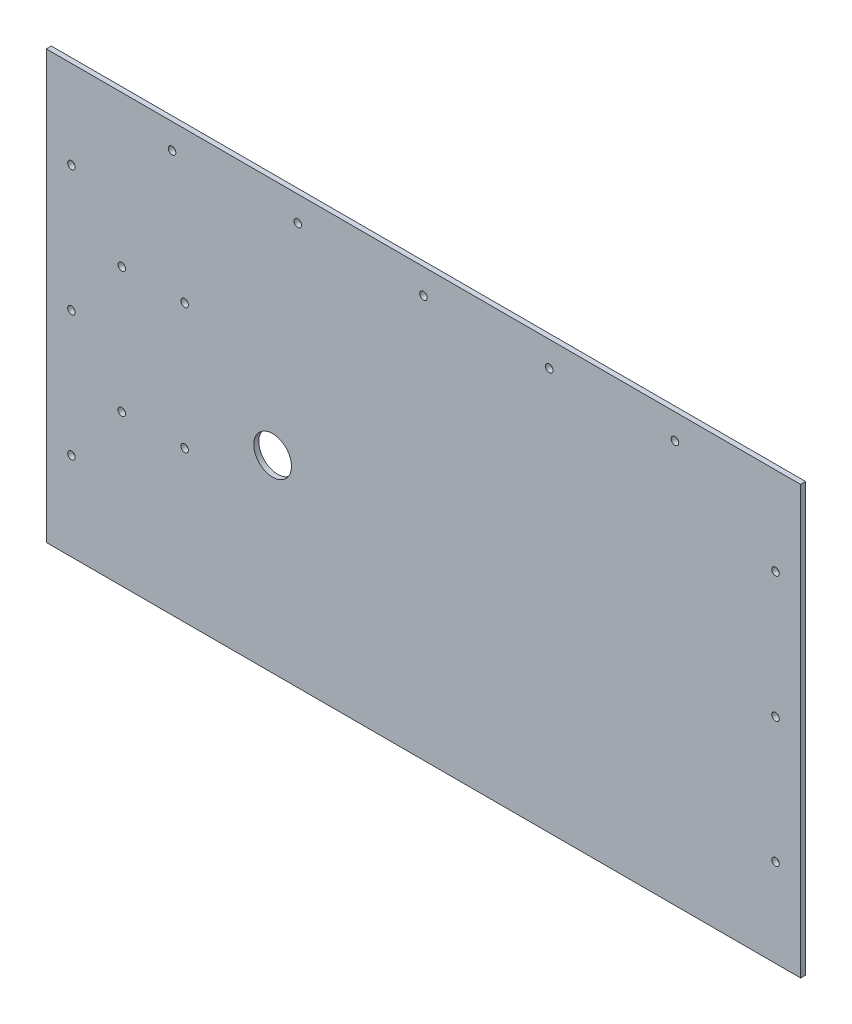
ISO-10303-21;
HEADER;
FILE_DESCRIPTION(('STEP AP214'),'2;1');
FILE_NAME('part.step','',(''),(''),'','','');
FILE_SCHEMA(('AUTOMOTIVE_DESIGN { 1 0 10303 214 1 1 1 1 }'));
ENDSEC;
DATA;
#1=APPLICATION_CONTEXT('core data for automotive mechanical design processes');
#2=APPLICATION_PROTOCOL_DEFINITION('international standard','automotive_design',2000,#1);
#3=PRODUCT_CONTEXT('',#1,'mechanical');
#4=PRODUCT('Part','Part','',(#3));
#5=PRODUCT_RELATED_PRODUCT_CATEGORY('part','',(#4));
#6=PRODUCT_DEFINITION_FORMATION('','',#4);
#7=PRODUCT_DEFINITION_CONTEXT('part definition',#1,'design');
#8=PRODUCT_DEFINITION('design','',#6,#7);
#9=PRODUCT_DEFINITION_SHAPE('','',#8);
#10=(LENGTH_UNIT() NAMED_UNIT(*) SI_UNIT(.MILLI.,.METRE.));
#11=(NAMED_UNIT(*) PLANE_ANGLE_UNIT() SI_UNIT($,.RADIAN.));
#12=(NAMED_UNIT(*) SI_UNIT($,.STERADIAN.) SOLID_ANGLE_UNIT());
#13=UNCERTAINTY_MEASURE_WITH_UNIT(LENGTH_MEASURE(1.E-05),#10,'distance_accuracy_value','');
#14=(GEOMETRIC_REPRESENTATION_CONTEXT(3) GLOBAL_UNCERTAINTY_ASSIGNED_CONTEXT((#13)) GLOBAL_UNIT_ASSIGNED_CONTEXT((#10,
#11,#12)) REPRESENTATION_CONTEXT('',''));
#15=CARTESIAN_POINT('',(0.,0.,0.));
#16=DIRECTION('',(0.,0.,1.));
#17=DIRECTION('',(1.,0.,0.));
#18=AXIS2_PLACEMENT_3D('',#15,#16,#17);
#19=CARTESIAN_POINT('',(150.,-85.,2.));
#20=DIRECTION('',(-1.,0.,0.));
#21=DIRECTION('',(0.,0.,1.));
#22=AXIS2_PLACEMENT_3D('',#19,#20,#21);
#23=PLANE('',#22);
#24=DIRECTION('',(0.,1.,0.));
#25=VECTOR('',#24,1.);
#26=CARTESIAN_POINT('',(150.,-85.,0.));
#27=LINE('',#26,#25);
#28=CARTESIAN_POINT('',(150.,-85.,0.));
#29=VERTEX_POINT('',#28);
#30=CARTESIAN_POINT('',(150.,85.,0.));
#31=VERTEX_POINT('',#30);
#32=EDGE_CURVE('E102',#29,#31,#27,.T.);
#33=ORIENTED_EDGE('',*,*,#32,.T.);
#34=DIRECTION('',(0.,0.,-1.));
#35=VECTOR('',#34,1.);
#36=CARTESIAN_POINT('',(150.,85.,2.));
#37=LINE('',#36,#35);
#38=CARTESIAN_POINT('',(150.,85.,2.));
#39=VERTEX_POINT('',#38);
#40=EDGE_CURVE('E93',#39,#31,#37,.T.);
#41=ORIENTED_EDGE('',*,*,#40,.F.);
#42=DIRECTION('',(0.,1.,0.));
#43=VECTOR('',#42,1.);
#44=CARTESIAN_POINT('',(150.,-85.,2.));
#45=LINE('',#44,#43);
#46=CARTESIAN_POINT('',(150.,-85.,2.));
#47=VERTEX_POINT('',#46);
#48=EDGE_CURVE('E87',#47,#39,#45,.T.);
#49=ORIENTED_EDGE('',*,*,#48,.F.);
#50=DIRECTION('',(0.,0.,-1.));
#51=VECTOR('',#50,1.);
#52=CARTESIAN_POINT('',(150.,-85.,2.));
#53=LINE('',#52,#51);
#54=EDGE_CURVE('E98',#47,#29,#53,.T.);
#55=ORIENTED_EDGE('',*,*,#54,.T.);
#56=EDGE_LOOP('',(#33,#41,#49,#55));
#57=FACE_BOUND('',#56,.T.);
#58=ADVANCED_FACE('F33',(#57),#23,.F.);
#59=CARTESIAN_POINT('',(-150.,85.,2.));
#60=DIRECTION('',(0.,-1.,0.));
#61=DIRECTION('',(0.,0.,-1.));
#62=AXIS2_PLACEMENT_3D('',#59,#60,#61);
#63=PLANE('',#62);
#64=DIRECTION('',(-1.,0.,0.));
#65=VECTOR('',#64,1.);
#66=CARTESIAN_POINT('',(-150.,85.,0.));
#67=LINE('',#66,#65);
#68=CARTESIAN_POINT('',(-150.,85.,0.));
#69=VERTEX_POINT('',#68);
#70=EDGE_CURVE('E92',#31,#69,#67,.T.);
#71=ORIENTED_EDGE('',*,*,#70,.T.);
#72=DIRECTION('',(0.,0.,-1.));
#73=VECTOR('',#72,1.);
#74=CARTESIAN_POINT('',(-150.,85.,2.));
#75=LINE('',#74,#73);
#76=CARTESIAN_POINT('',(-150.,85.,2.));
#77=VERTEX_POINT('',#76);
#78=EDGE_CURVE('E90',#77,#69,#75,.T.);
#79=ORIENTED_EDGE('',*,*,#78,.F.);
#80=DIRECTION('',(-1.,0.,0.));
#81=VECTOR('',#80,1.);
#82=CARTESIAN_POINT('',(-150.,85.,2.));
#83=LINE('',#82,#81);
#84=EDGE_CURVE('E81',#39,#77,#83,.T.);
#85=ORIENTED_EDGE('',*,*,#84,.F.);
#86=ORIENTED_EDGE('',*,*,#40,.T.);
#87=EDGE_LOOP('',(#71,#79,#85,#86));
#88=FACE_BOUND('',#87,.T.);
#89=ADVANCED_FACE('F91',(#88),#63,.F.);
#90=CARTESIAN_POINT('',(-150.,-85.,2.));
#91=DIRECTION('',(1.,0.,0.));
#92=DIRECTION('',(0.,0.,-1.));
#93=AXIS2_PLACEMENT_3D('',#90,#91,#92);
#94=PLANE('',#93);
#95=DIRECTION('',(0.,-1.,0.));
#96=VECTOR('',#95,1.);
#97=CARTESIAN_POINT('',(-150.,-85.,0.));
#98=LINE('',#97,#96);
#99=CARTESIAN_POINT('',(-150.,-85.,0.));
#100=VERTEX_POINT('',#99);
#101=EDGE_CURVE('E67',#69,#100,#98,.T.);
#102=ORIENTED_EDGE('',*,*,#101,.T.);
#103=DIRECTION('',(0.,0.,-1.));
#104=VECTOR('',#103,1.);
#105=CARTESIAN_POINT('',(-150.,-85.,2.));
#106=LINE('',#105,#104);
#107=CARTESIAN_POINT('',(-150.,-85.,2.));
#108=VERTEX_POINT('',#107);
#109=EDGE_CURVE('E94',#108,#100,#106,.T.);
#110=ORIENTED_EDGE('',*,*,#109,.F.);
#111=DIRECTION('',(0.,-1.,0.));
#112=VECTOR('',#111,1.);
#113=CARTESIAN_POINT('',(-150.,-85.,2.));
#114=LINE('',#113,#112);
#115=EDGE_CURVE('E85',#77,#108,#114,.T.);
#116=ORIENTED_EDGE('',*,*,#115,.F.);
#117=ORIENTED_EDGE('',*,*,#78,.T.);
#118=EDGE_LOOP('',(#102,#110,#116,#117));
#119=FACE_BOUND('',#118,.T.);
#120=ADVANCED_FACE('F96',(#119),#94,.F.);
#121=CARTESIAN_POINT('',(-150.,-85.,2.));
#122=DIRECTION('',(0.,1.,0.));
#123=DIRECTION('',(0.,0.,1.));
#124=AXIS2_PLACEMENT_3D('',#121,#122,#123);
#125=PLANE('',#124);
#126=DIRECTION('',(1.,0.,0.));
#127=VECTOR('',#126,1.);
#128=CARTESIAN_POINT('',(-150.,-85.,0.));
#129=LINE('',#128,#127);
#130=EDGE_CURVE('E73',#100,#29,#129,.T.);
#131=ORIENTED_EDGE('',*,*,#130,.T.);
#132=ORIENTED_EDGE('',*,*,#54,.F.);
#133=DIRECTION('',(1.,0.,0.));
#134=VECTOR('',#133,1.);
#135=CARTESIAN_POINT('',(-150.,-85.,2.));
#136=LINE('',#135,#134);
#137=EDGE_CURVE('E50',#108,#47,#136,.T.);
#138=ORIENTED_EDGE('',*,*,#137,.F.);
#139=ORIENTED_EDGE('',*,*,#109,.T.);
#140=EDGE_LOOP('',(#131,#132,#138,#139));
#141=FACE_BOUND('',#140,.T.);
#142=ADVANCED_FACE('F181',(#141),#125,.F.);
#143=CARTESIAN_POINT('',(150.,85.,2.));
#144=DIRECTION('',(0.,0.,-1.));
#145=DIRECTION('',(-1.,0.,0.));
#146=AXIS2_PLACEMENT_3D('',#143,#144,#145);
#147=PLANE('',#146);
#148=CARTESIAN_POINT('',(-60.,-10.,2.));
#149=DIRECTION('',(0.,0.,1.));
#150=DIRECTION('',(1.,0.,0.));
#151=AXIS2_PLACEMENT_3D('',#148,#149,#150);
#152=CIRCLE('',#151,7.5);
#153=CARTESIAN_POINT('',(-52.5,-10.,2.));
#154=VERTEX_POINT('',#153);
#155=EDGE_CURVE('E496',#154,#154,#152,.T.);
#156=ORIENTED_EDGE('',*,*,#155,.F.);
#157=EDGE_LOOP('',(#156));
#158=FACE_BOUND('',#157,.T.);
#159=CARTESIAN_POINT('',(-120.,-25.,2.));
#160=DIRECTION('',(0.,0.,1.));
#161=DIRECTION('',(1.,0.,0.));
#162=AXIS2_PLACEMENT_3D('',#159,#160,#161);
#163=CIRCLE('',#162,1.5);
#164=CARTESIAN_POINT('',(-118.5,-25.,2.));
#165=VERTEX_POINT('',#164);
#166=EDGE_CURVE('E502',#165,#165,#163,.T.);
#167=ORIENTED_EDGE('',*,*,#166,.F.);
#168=EDGE_LOOP('',(#167));
#169=FACE_BOUND('',#168,.T.);
#170=CARTESIAN_POINT('',(-120.,25.,2.));
#171=DIRECTION('',(0.,0.,1.));
#172=DIRECTION('',(1.,0.,0.));
#173=AXIS2_PLACEMENT_3D('',#170,#171,#172);
#174=CIRCLE('',#173,1.5);
#175=CARTESIAN_POINT('',(-118.5,25.,2.));
#176=VERTEX_POINT('',#175);
#177=EDGE_CURVE('E159',#176,#176,#174,.T.);
#178=ORIENTED_EDGE('',*,*,#177,.F.);
#179=EDGE_LOOP('',(#178));
#180=FACE_BOUND('',#179,.T.);
#181=CARTESIAN_POINT('',(-140.,0.,2.));
#182=DIRECTION('',(0.,0.,1.));
#183=DIRECTION('',(1.,0.,0.));
#184=AXIS2_PLACEMENT_3D('',#181,#182,#183);
#185=CIRCLE('',#184,1.5);
#186=CARTESIAN_POINT('',(-138.5,0.,2.));
#187=VERTEX_POINT('',#186);
#188=EDGE_CURVE('E509',#187,#187,#185,.T.);
#189=ORIENTED_EDGE('',*,*,#188,.F.);
#190=EDGE_LOOP('',(#189));
#191=FACE_BOUND('',#190,.T.);
#192=CARTESIAN_POINT('',(-140.,50.,2.));
#193=DIRECTION('',(0.,0.,1.));
#194=DIRECTION('',(1.,0.,0.));
#195=AXIS2_PLACEMENT_3D('',#192,#193,#194);
#196=CIRCLE('',#195,1.5);
#197=CARTESIAN_POINT('',(-138.5,50.,2.));
#198=VERTEX_POINT('',#197);
#199=EDGE_CURVE('E512',#198,#198,#196,.T.);
#200=ORIENTED_EDGE('',*,*,#199,.F.);
#201=EDGE_LOOP('',(#200));
#202=FACE_BOUND('',#201,.T.);
#203=CARTESIAN_POINT('',(-50.,75.,2.));
#204=DIRECTION('',(0.,0.,1.));
#205=DIRECTION('',(1.,0.,0.));
#206=AXIS2_PLACEMENT_3D('',#203,#204,#205);
#207=CIRCLE('',#206,1.5);
#208=CARTESIAN_POINT('',(-48.5,75.,2.));
#209=VERTEX_POINT('',#208);
#210=EDGE_CURVE('E269',#209,#209,#207,.T.);
#211=ORIENTED_EDGE('',*,*,#210,.F.);
#212=EDGE_LOOP('',(#211));
#213=FACE_BOUND('',#212,.T.);
#214=CARTESIAN_POINT('',(-100.,75.,2.));
#215=DIRECTION('',(0.,0.,1.));
#216=DIRECTION('',(1.,0.,0.));
#217=AXIS2_PLACEMENT_3D('',#214,#215,#216);
#218=CIRCLE('',#217,1.5);
#219=CARTESIAN_POINT('',(-98.5,75.,2.));
#220=VERTEX_POINT('',#219);
#221=EDGE_CURVE('E271',#220,#220,#218,.T.);
#222=ORIENTED_EDGE('',*,*,#221,.F.);
#223=EDGE_LOOP('',(#222));
#224=FACE_BOUND('',#223,.T.);
#225=ORIENTED_EDGE('',*,*,#48,.T.);
#226=ORIENTED_EDGE('',*,*,#84,.T.);
#227=ORIENTED_EDGE('',*,*,#115,.T.);
#228=ORIENTED_EDGE('',*,*,#137,.T.);
#229=EDGE_LOOP('',(#225,#226,#227,#228));
#230=FACE_BOUND('',#229,.T.);
#231=CARTESIAN_POINT('',(0.,75.,2.));
#232=DIRECTION('',(0.,0.,1.));
#233=DIRECTION('',(1.,0.,0.));
#234=AXIS2_PLACEMENT_3D('',#231,#232,#233);
#235=CIRCLE('',#234,1.5);
#236=CARTESIAN_POINT('',(1.50000000000003,75.,2.));
#237=VERTEX_POINT('',#236);
#238=EDGE_CURVE('E115',#237,#237,#235,.T.);
#239=ORIENTED_EDGE('',*,*,#238,.F.);
#240=EDGE_LOOP('',(#239));
#241=FACE_BOUND('',#240,.T.);
#242=CARTESIAN_POINT('',(50.,75.,2.));
#243=DIRECTION('',(0.,0.,1.));
#244=DIRECTION('',(1.,0.,0.));
#245=AXIS2_PLACEMENT_3D('',#242,#243,#244);
#246=CIRCLE('',#245,1.5);
#247=CARTESIAN_POINT('',(51.5,75.,2.));
#248=VERTEX_POINT('',#247);
#249=EDGE_CURVE('E121',#248,#248,#246,.T.);
#250=ORIENTED_EDGE('',*,*,#249,.F.);
#251=EDGE_LOOP('',(#250));
#252=FACE_BOUND('',#251,.T.);
#253=CARTESIAN_POINT('',(100.,75.,2.));
#254=DIRECTION('',(0.,0.,1.));
#255=DIRECTION('',(1.,0.,0.));
#256=AXIS2_PLACEMENT_3D('',#253,#254,#255);
#257=CIRCLE('',#256,1.5);
#258=CARTESIAN_POINT('',(101.5,75.,2.));
#259=VERTEX_POINT('',#258);
#260=EDGE_CURVE('E127',#259,#259,#257,.T.);
#261=ORIENTED_EDGE('',*,*,#260,.F.);
#262=EDGE_LOOP('',(#261));
#263=FACE_BOUND('',#262,.T.);
#264=CARTESIAN_POINT('',(-140.,-50.,2.));
#265=DIRECTION('',(0.,0.,1.));
#266=DIRECTION('',(1.,0.,0.));
#267=AXIS2_PLACEMENT_3D('',#264,#265,#266);
#268=CIRCLE('',#267,1.5);
#269=CARTESIAN_POINT('',(-138.5,-50.,2.));
#270=VERTEX_POINT('',#269);
#271=EDGE_CURVE('E133',#270,#270,#268,.T.);
#272=ORIENTED_EDGE('',*,*,#271,.F.);
#273=EDGE_LOOP('',(#272));
#274=FACE_BOUND('',#273,.T.);
#275=CARTESIAN_POINT('',(140.,50.,2.));
#276=DIRECTION('',(0.,0.,1.));
#277=DIRECTION('',(1.,0.,0.));
#278=AXIS2_PLACEMENT_3D('',#275,#276,#277);
#279=CIRCLE('',#278,1.5);
#280=CARTESIAN_POINT('',(141.5,50.,2.));
#281=VERTEX_POINT('',#280);
#282=EDGE_CURVE('E139',#281,#281,#279,.T.);
#283=ORIENTED_EDGE('',*,*,#282,.F.);
#284=EDGE_LOOP('',(#283));
#285=FACE_BOUND('',#284,.T.);
#286=CARTESIAN_POINT('',(140.,0.,2.));
#287=DIRECTION('',(0.,0.,1.));
#288=DIRECTION('',(1.,0.,0.));
#289=AXIS2_PLACEMENT_3D('',#286,#287,#288);
#290=CIRCLE('',#289,1.5);
#291=CARTESIAN_POINT('',(141.5,0.,2.));
#292=VERTEX_POINT('',#291);
#293=EDGE_CURVE('E145',#292,#292,#290,.T.);
#294=ORIENTED_EDGE('',*,*,#293,.F.);
#295=EDGE_LOOP('',(#294));
#296=FACE_BOUND('',#295,.T.);
#297=CARTESIAN_POINT('',(140.,-50.,2.));
#298=DIRECTION('',(0.,0.,1.));
#299=DIRECTION('',(1.,0.,0.));
#300=AXIS2_PLACEMENT_3D('',#297,#298,#299);
#301=CIRCLE('',#300,1.5);
#302=CARTESIAN_POINT('',(141.5,-50.,2.));
#303=VERTEX_POINT('',#302);
#304=EDGE_CURVE('E151',#303,#303,#301,.T.);
#305=ORIENTED_EDGE('',*,*,#304,.F.);
#306=EDGE_LOOP('',(#305));
#307=FACE_BOUND('',#306,.T.);
#308=CARTESIAN_POINT('',(-95.,25.,2.));
#309=DIRECTION('',(0.,0.,1.));
#310=DIRECTION('',(1.,0.,0.));
#311=AXIS2_PLACEMENT_3D('',#308,#309,#310);
#312=CIRCLE('',#311,1.5);
#313=CARTESIAN_POINT('',(-93.5,25.,2.));
#314=VERTEX_POINT('',#313);
#315=EDGE_CURVE('E162',#314,#314,#312,.T.);
#316=ORIENTED_EDGE('',*,*,#315,.F.);
#317=EDGE_LOOP('',(#316));
#318=FACE_BOUND('',#317,.T.);
#319=CARTESIAN_POINT('',(-95.,-25.,2.));
#320=DIRECTION('',(0.,0.,1.));
#321=DIRECTION('',(1.,0.,0.));
#322=AXIS2_PLACEMENT_3D('',#319,#320,#321);
#323=CIRCLE('',#322,1.5);
#324=CARTESIAN_POINT('',(-93.5,-25.,2.));
#325=VERTEX_POINT('',#324);
#326=EDGE_CURVE('E11',#325,#325,#323,.T.);
#327=ORIENTED_EDGE('',*,*,#326,.F.);
#328=EDGE_LOOP('',(#327));
#329=FACE_BOUND('',#328,.T.);
#330=ADVANCED_FACE('F82',(#158,#169,#180,#191,#202,#213,#224,#230,#241,#252,#263,#274,#285,#296,
#307,#318,#329),#147,.F.);
#331=CARTESIAN_POINT('',(150.,85.,0.));
#332=DIRECTION('',(0.,0.,-1.));
#333=DIRECTION('',(-1.,0.,0.));
#334=AXIS2_PLACEMENT_3D('',#331,#332,#333);
#335=PLANE('',#334);
#336=CARTESIAN_POINT('',(-60.,-10.,0.));
#337=DIRECTION('',(0.,0.,1.));
#338=DIRECTION('',(1.,0.,0.));
#339=AXIS2_PLACEMENT_3D('',#336,#337,#338);
#340=CIRCLE('',#339,7.5);
#341=CARTESIAN_POINT('',(-52.5,-10.,0.));
#342=VERTEX_POINT('',#341);
#343=EDGE_CURVE('E493',#342,#342,#340,.T.);
#344=ORIENTED_EDGE('',*,*,#343,.T.);
#345=EDGE_LOOP('',(#344));
#346=FACE_BOUND('',#345,.T.);
#347=CARTESIAN_POINT('',(-120.,-25.,0.));
#348=DIRECTION('',(0.,0.,-1.));
#349=DIRECTION('',(-1.,0.,0.));
#350=AXIS2_PLACEMENT_3D('',#347,#348,#349);
#351=CIRCLE('',#350,1.5);
#352=CARTESIAN_POINT('',(-121.5,-25.,0.));
#353=VERTEX_POINT('',#352);
#354=EDGE_CURVE('E498',#353,#353,#351,.T.);
#355=ORIENTED_EDGE('',*,*,#354,.F.);
#356=EDGE_LOOP('',(#355));
#357=FACE_BOUND('',#356,.T.);
#358=CARTESIAN_POINT('',(-120.,25.,0.));
#359=DIRECTION('',(0.,0.,-1.));
#360=DIRECTION('',(-1.,0.,0.));
#361=AXIS2_PLACEMENT_3D('',#358,#359,#360);
#362=CIRCLE('',#361,1.5);
#363=CARTESIAN_POINT('',(-121.5,25.,0.));
#364=VERTEX_POINT('',#363);
#365=EDGE_CURVE('E155',#364,#364,#362,.T.);
#366=ORIENTED_EDGE('',*,*,#365,.F.);
#367=EDGE_LOOP('',(#366));
#368=FACE_BOUND('',#367,.T.);
#369=CARTESIAN_POINT('',(-140.,0.,0.));
#370=DIRECTION('',(0.,0.,1.));
#371=DIRECTION('',(1.,0.,0.));
#372=AXIS2_PLACEMENT_3D('',#369,#370,#371);
#373=CIRCLE('',#372,1.5);
#374=CARTESIAN_POINT('',(-138.5,0.,0.));
#375=VERTEX_POINT('',#374);
#376=EDGE_CURVE('E158',#375,#375,#373,.T.);
#377=ORIENTED_EDGE('',*,*,#376,.T.);
#378=EDGE_LOOP('',(#377));
#379=FACE_BOUND('',#378,.T.);
#380=CARTESIAN_POINT('',(-140.,50.,0.));
#381=DIRECTION('',(0.,0.,1.));
#382=DIRECTION('',(1.,0.,0.));
#383=AXIS2_PLACEMENT_3D('',#380,#381,#382);
#384=CIRCLE('',#383,1.5);
#385=CARTESIAN_POINT('',(-138.5,50.,0.));
#386=VERTEX_POINT('',#385);
#387=EDGE_CURVE('E275',#386,#386,#384,.T.);
#388=ORIENTED_EDGE('',*,*,#387,.T.);
#389=EDGE_LOOP('',(#388));
#390=FACE_BOUND('',#389,.T.);
#391=CARTESIAN_POINT('',(-50.,75.,0.));
#392=DIRECTION('',(0.,0.,1.));
#393=DIRECTION('',(1.,0.,0.));
#394=AXIS2_PLACEMENT_3D('',#391,#392,#393);
#395=CIRCLE('',#394,1.5);
#396=CARTESIAN_POINT('',(-48.5,75.,0.));
#397=VERTEX_POINT('',#396);
#398=EDGE_CURVE('E266',#397,#397,#395,.T.);
#399=ORIENTED_EDGE('',*,*,#398,.T.);
#400=EDGE_LOOP('',(#399));
#401=FACE_BOUND('',#400,.T.);
#402=CARTESIAN_POINT('',(-100.,75.,0.));
#403=DIRECTION('',(0.,0.,1.));
#404=DIRECTION('',(1.,0.,0.));
#405=AXIS2_PLACEMENT_3D('',#402,#403,#404);
#406=CIRCLE('',#405,1.5);
#407=CARTESIAN_POINT('',(-98.5,75.,0.));
#408=VERTEX_POINT('',#407);
#409=EDGE_CURVE('E105',#408,#408,#406,.T.);
#410=ORIENTED_EDGE('',*,*,#409,.T.);
#411=EDGE_LOOP('',(#410));
#412=FACE_BOUND('',#411,.T.);
#413=ORIENTED_EDGE('',*,*,#32,.F.);
#414=ORIENTED_EDGE('',*,*,#130,.F.);
#415=ORIENTED_EDGE('',*,*,#101,.F.);
#416=ORIENTED_EDGE('',*,*,#70,.F.);
#417=EDGE_LOOP('',(#413,#414,#415,#416));
#418=FACE_BOUND('',#417,.T.);
#419=CARTESIAN_POINT('',(0.,75.,0.));
#420=DIRECTION('',(0.,0.,1.));
#421=DIRECTION('',(1.,0.,0.));
#422=AXIS2_PLACEMENT_3D('',#419,#420,#421);
#423=CIRCLE('',#422,1.5);
#424=CARTESIAN_POINT('',(1.50000000000003,75.,0.));
#425=VERTEX_POINT('',#424);
#426=EDGE_CURVE('E112',#425,#425,#423,.T.);
#427=ORIENTED_EDGE('',*,*,#426,.T.);
#428=EDGE_LOOP('',(#427));
#429=FACE_BOUND('',#428,.T.);
#430=CARTESIAN_POINT('',(50.,75.,0.));
#431=DIRECTION('',(0.,0.,1.));
#432=DIRECTION('',(1.,0.,0.));
#433=AXIS2_PLACEMENT_3D('',#430,#431,#432);
#434=CIRCLE('',#433,1.5);
#435=CARTESIAN_POINT('',(51.5,75.,0.));
#436=VERTEX_POINT('',#435);
#437=EDGE_CURVE('E118',#436,#436,#434,.T.);
#438=ORIENTED_EDGE('',*,*,#437,.T.);
#439=EDGE_LOOP('',(#438));
#440=FACE_BOUND('',#439,.T.);
#441=CARTESIAN_POINT('',(100.,75.,0.));
#442=DIRECTION('',(0.,0.,1.));
#443=DIRECTION('',(1.,0.,0.));
#444=AXIS2_PLACEMENT_3D('',#441,#442,#443);
#445=CIRCLE('',#444,1.5);
#446=CARTESIAN_POINT('',(101.5,75.,0.));
#447=VERTEX_POINT('',#446);
#448=EDGE_CURVE('E124',#447,#447,#445,.T.);
#449=ORIENTED_EDGE('',*,*,#448,.T.);
#450=EDGE_LOOP('',(#449));
#451=FACE_BOUND('',#450,.T.);
#452=CARTESIAN_POINT('',(-140.,-50.,0.));
#453=DIRECTION('',(0.,0.,1.));
#454=DIRECTION('',(1.,0.,0.));
#455=AXIS2_PLACEMENT_3D('',#452,#453,#454);
#456=CIRCLE('',#455,1.5);
#457=CARTESIAN_POINT('',(-138.5,-50.,0.));
#458=VERTEX_POINT('',#457);
#459=EDGE_CURVE('E130',#458,#458,#456,.T.);
#460=ORIENTED_EDGE('',*,*,#459,.T.);
#461=EDGE_LOOP('',(#460));
#462=FACE_BOUND('',#461,.T.);
#463=CARTESIAN_POINT('',(140.,50.,0.));
#464=DIRECTION('',(0.,0.,1.));
#465=DIRECTION('',(1.,0.,0.));
#466=AXIS2_PLACEMENT_3D('',#463,#464,#465);
#467=CIRCLE('',#466,1.5);
#468=CARTESIAN_POINT('',(141.5,50.,0.));
#469=VERTEX_POINT('',#468);
#470=EDGE_CURVE('E136',#469,#469,#467,.T.);
#471=ORIENTED_EDGE('',*,*,#470,.T.);
#472=EDGE_LOOP('',(#471));
#473=FACE_BOUND('',#472,.T.);
#474=CARTESIAN_POINT('',(140.,0.,0.));
#475=DIRECTION('',(0.,0.,1.));
#476=DIRECTION('',(1.,0.,0.));
#477=AXIS2_PLACEMENT_3D('',#474,#475,#476);
#478=CIRCLE('',#477,1.5);
#479=CARTESIAN_POINT('',(141.5,0.,0.));
#480=VERTEX_POINT('',#479);
#481=EDGE_CURVE('E142',#480,#480,#478,.T.);
#482=ORIENTED_EDGE('',*,*,#481,.T.);
#483=EDGE_LOOP('',(#482));
#484=FACE_BOUND('',#483,.T.);
#485=CARTESIAN_POINT('',(140.,-50.,0.));
#486=DIRECTION('',(0.,0.,1.));
#487=DIRECTION('',(1.,0.,0.));
#488=AXIS2_PLACEMENT_3D('',#485,#486,#487);
#489=CIRCLE('',#488,1.5);
#490=CARTESIAN_POINT('',(141.5,-50.,0.));
#491=VERTEX_POINT('',#490);
#492=EDGE_CURVE('E148',#491,#491,#489,.T.);
#493=ORIENTED_EDGE('',*,*,#492,.T.);
#494=EDGE_LOOP('',(#493));
#495=FACE_BOUND('',#494,.T.);
#496=CARTESIAN_POINT('',(-95.,25.,0.));
#497=DIRECTION('',(0.,0.,-1.));
#498=DIRECTION('',(-1.,0.,0.));
#499=AXIS2_PLACEMENT_3D('',#496,#497,#498);
#500=CIRCLE('',#499,1.5);
#501=CARTESIAN_POINT('',(-96.5,25.,0.));
#502=VERTEX_POINT('',#501);
#503=EDGE_CURVE('E154',#502,#502,#500,.T.);
#504=ORIENTED_EDGE('',*,*,#503,.F.);
#505=EDGE_LOOP('',(#504));
#506=FACE_BOUND('',#505,.T.);
#507=CARTESIAN_POINT('',(-95.,-25.,0.));
#508=DIRECTION('',(0.,0.,-1.));
#509=DIRECTION('',(-1.,0.,0.));
#510=AXIS2_PLACEMENT_3D('',#507,#508,#509);
#511=CIRCLE('',#510,1.5);
#512=CARTESIAN_POINT('',(-96.5,-25.,0.));
#513=VERTEX_POINT('',#512);
#514=EDGE_CURVE('E42',#513,#513,#511,.T.);
#515=ORIENTED_EDGE('',*,*,#514,.F.);
#516=EDGE_LOOP('',(#515));
#517=FACE_BOUND('',#516,.T.);
#518=ADVANCED_FACE('F169',(#346,#357,#368,#379,#390,#401,#412,#418,#429,#440,#451,#462,#473,
#484,#495,#506,#517),#335,.T.);
#519=CARTESIAN_POINT('',(-100.,75.,0.));
#520=DIRECTION('',(0.,0.,1.));
#521=DIRECTION('',(1.,0.,0.));
#522=AXIS2_PLACEMENT_3D('',#519,#520,#521);
#523=CYLINDRICAL_SURFACE('',#522,1.5);
#524=ORIENTED_EDGE('',*,*,#409,.F.);
#525=EDGE_LOOP('',(#524));
#526=FACE_BOUND('',#525,.T.);
#527=ORIENTED_EDGE('',*,*,#221,.T.);
#528=EDGE_LOOP('',(#527));
#529=FACE_BOUND('',#528,.T.);
#530=ADVANCED_FACE('F171',(#526,#529),#523,.F.);
#531=CARTESIAN_POINT('',(-50.,75.,0.));
#532=DIRECTION('',(0.,0.,1.));
#533=DIRECTION('',(1.,0.,0.));
#534=AXIS2_PLACEMENT_3D('',#531,#532,#533);
#535=CYLINDRICAL_SURFACE('',#534,1.5);
#536=ORIENTED_EDGE('',*,*,#398,.F.);
#537=EDGE_LOOP('',(#536));
#538=FACE_BOUND('',#537,.T.);
#539=ORIENTED_EDGE('',*,*,#210,.T.);
#540=EDGE_LOOP('',(#539));
#541=FACE_BOUND('',#540,.T.);
#542=ADVANCED_FACE('F178',(#538,#541),#535,.F.);
#543=CARTESIAN_POINT('',(0.,75.,0.));
#544=DIRECTION('',(0.,0.,1.));
#545=DIRECTION('',(1.,0.,0.));
#546=AXIS2_PLACEMENT_3D('',#543,#544,#545);
#547=CYLINDRICAL_SURFACE('',#546,1.5);
#548=ORIENTED_EDGE('',*,*,#426,.F.);
#549=EDGE_LOOP('',(#548));
#550=FACE_BOUND('',#549,.T.);
#551=ORIENTED_EDGE('',*,*,#238,.T.);
#552=EDGE_LOOP('',(#551));
#553=FACE_BOUND('',#552,.T.);
#554=ADVANCED_FACE('F196',(#550,#553),#547,.F.);
#555=CARTESIAN_POINT('',(50.,75.,0.));
#556=DIRECTION('',(0.,0.,1.));
#557=DIRECTION('',(1.,0.,0.));
#558=AXIS2_PLACEMENT_3D('',#555,#556,#557);
#559=CYLINDRICAL_SURFACE('',#558,1.5);
#560=ORIENTED_EDGE('',*,*,#437,.F.);
#561=EDGE_LOOP('',(#560));
#562=FACE_BOUND('',#561,.T.);
#563=ORIENTED_EDGE('',*,*,#249,.T.);
#564=EDGE_LOOP('',(#563));
#565=FACE_BOUND('',#564,.T.);
#566=ADVANCED_FACE('F199',(#562,#565),#559,.F.);
#567=CARTESIAN_POINT('',(100.,75.,0.));
#568=DIRECTION('',(0.,0.,1.));
#569=DIRECTION('',(1.,0.,0.));
#570=AXIS2_PLACEMENT_3D('',#567,#568,#569);
#571=CYLINDRICAL_SURFACE('',#570,1.5);
#572=ORIENTED_EDGE('',*,*,#448,.F.);
#573=EDGE_LOOP('',(#572));
#574=FACE_BOUND('',#573,.T.);
#575=ORIENTED_EDGE('',*,*,#260,.T.);
#576=EDGE_LOOP('',(#575));
#577=FACE_BOUND('',#576,.T.);
#578=ADVANCED_FACE('F203',(#574,#577),#571,.F.);
#579=CARTESIAN_POINT('',(-140.,50.,0.));
#580=DIRECTION('',(0.,0.,1.));
#581=DIRECTION('',(1.,0.,0.));
#582=AXIS2_PLACEMENT_3D('',#579,#580,#581);
#583=CYLINDRICAL_SURFACE('',#582,1.5);
#584=ORIENTED_EDGE('',*,*,#387,.F.);
#585=EDGE_LOOP('',(#584));
#586=FACE_BOUND('',#585,.T.);
#587=ORIENTED_EDGE('',*,*,#199,.T.);
#588=EDGE_LOOP('',(#587));
#589=FACE_BOUND('',#588,.T.);
#590=ADVANCED_FACE('F207',(#586,#589),#583,.F.);
#591=CARTESIAN_POINT('',(-140.,0.,0.));
#592=DIRECTION('',(0.,0.,1.));
#593=DIRECTION('',(1.,0.,0.));
#594=AXIS2_PLACEMENT_3D('',#591,#592,#593);
#595=CYLINDRICAL_SURFACE('',#594,1.5);
#596=ORIENTED_EDGE('',*,*,#376,.F.);
#597=EDGE_LOOP('',(#596));
#598=FACE_BOUND('',#597,.T.);
#599=ORIENTED_EDGE('',*,*,#188,.T.);
#600=EDGE_LOOP('',(#599));
#601=FACE_BOUND('',#600,.T.);
#602=ADVANCED_FACE('F213',(#598,#601),#595,.F.);
#603=CARTESIAN_POINT('',(-140.,-50.,0.));
#604=DIRECTION('',(0.,0.,1.));
#605=DIRECTION('',(1.,0.,0.));
#606=AXIS2_PLACEMENT_3D('',#603,#604,#605);
#607=CYLINDRICAL_SURFACE('',#606,1.5);
#608=ORIENTED_EDGE('',*,*,#459,.F.);
#609=EDGE_LOOP('',(#608));
#610=FACE_BOUND('',#609,.T.);
#611=ORIENTED_EDGE('',*,*,#271,.T.);
#612=EDGE_LOOP('',(#611));
#613=FACE_BOUND('',#612,.T.);
#614=ADVANCED_FACE('F209',(#610,#613),#607,.F.);
#615=CARTESIAN_POINT('',(140.,50.,0.));
#616=DIRECTION('',(0.,0.,1.));
#617=DIRECTION('',(1.,0.,0.));
#618=AXIS2_PLACEMENT_3D('',#615,#616,#617);
#619=CYLINDRICAL_SURFACE('',#618,1.5);
#620=ORIENTED_EDGE('',*,*,#470,.F.);
#621=EDGE_LOOP('',(#620));
#622=FACE_BOUND('',#621,.T.);
#623=ORIENTED_EDGE('',*,*,#282,.T.);
#624=EDGE_LOOP('',(#623));
#625=FACE_BOUND('',#624,.T.);
#626=ADVANCED_FACE('F212',(#622,#625),#619,.F.);
#627=CARTESIAN_POINT('',(140.,0.,0.));
#628=DIRECTION('',(0.,0.,1.));
#629=DIRECTION('',(1.,0.,0.));
#630=AXIS2_PLACEMENT_3D('',#627,#628,#629);
#631=CYLINDRICAL_SURFACE('',#630,1.5);
#632=ORIENTED_EDGE('',*,*,#481,.F.);
#633=EDGE_LOOP('',(#632));
#634=FACE_BOUND('',#633,.T.);
#635=ORIENTED_EDGE('',*,*,#293,.T.);
#636=EDGE_LOOP('',(#635));
#637=FACE_BOUND('',#636,.T.);
#638=ADVANCED_FACE('F217',(#634,#637),#631,.F.);
#639=CARTESIAN_POINT('',(140.,-50.,0.));
#640=DIRECTION('',(0.,0.,1.));
#641=DIRECTION('',(1.,0.,0.));
#642=AXIS2_PLACEMENT_3D('',#639,#640,#641);
#643=CYLINDRICAL_SURFACE('',#642,1.5);
#644=ORIENTED_EDGE('',*,*,#492,.F.);
#645=EDGE_LOOP('',(#644));
#646=FACE_BOUND('',#645,.T.);
#647=ORIENTED_EDGE('',*,*,#304,.T.);
#648=EDGE_LOOP('',(#647));
#649=FACE_BOUND('',#648,.T.);
#650=ADVANCED_FACE('F221',(#646,#649),#643,.F.);
#651=CARTESIAN_POINT('',(-120.,25.,-8.));
#652=DIRECTION('',(0.,0.,1.));
#653=DIRECTION('',(1.,0.,0.));
#654=AXIS2_PLACEMENT_3D('',#651,#652,#653);
#655=CYLINDRICAL_SURFACE('',#654,1.5);
#656=ORIENTED_EDGE('',*,*,#365,.T.);
#657=EDGE_LOOP('',(#656));
#658=FACE_BOUND('',#657,.T.);
#659=ORIENTED_EDGE('',*,*,#177,.T.);
#660=EDGE_LOOP('',(#659));
#661=FACE_BOUND('',#660,.T.);
#662=ADVANCED_FACE('F224',(#658,#661),#655,.F.);
#663=CARTESIAN_POINT('',(-120.,-25.,-8.));
#664=DIRECTION('',(0.,0.,1.));
#665=DIRECTION('',(1.,0.,0.));
#666=AXIS2_PLACEMENT_3D('',#663,#664,#665);
#667=CYLINDRICAL_SURFACE('',#666,1.5);
#668=ORIENTED_EDGE('',*,*,#354,.T.);
#669=EDGE_LOOP('',(#668));
#670=FACE_BOUND('',#669,.T.);
#671=ORIENTED_EDGE('',*,*,#166,.T.);
#672=EDGE_LOOP('',(#671));
#673=FACE_BOUND('',#672,.T.);
#674=ADVANCED_FACE('F228',(#670,#673),#667,.F.);
#675=CARTESIAN_POINT('',(-95.,25.,-8.));
#676=DIRECTION('',(0.,0.,1.));
#677=DIRECTION('',(1.,0.,0.));
#678=AXIS2_PLACEMENT_3D('',#675,#676,#677);
#679=CYLINDRICAL_SURFACE('',#678,1.5);
#680=ORIENTED_EDGE('',*,*,#503,.T.);
#681=EDGE_LOOP('',(#680));
#682=FACE_BOUND('',#681,.T.);
#683=ORIENTED_EDGE('',*,*,#315,.T.);
#684=EDGE_LOOP('',(#683));
#685=FACE_BOUND('',#684,.T.);
#686=ADVANCED_FACE('F226',(#682,#685),#679,.F.);
#687=CARTESIAN_POINT('',(-95.,-25.,-8.));
#688=DIRECTION('',(0.,0.,1.));
#689=DIRECTION('',(1.,0.,0.));
#690=AXIS2_PLACEMENT_3D('',#687,#688,#689);
#691=CYLINDRICAL_SURFACE('',#690,1.5);
#692=ORIENTED_EDGE('',*,*,#514,.T.);
#693=EDGE_LOOP('',(#692));
#694=FACE_BOUND('',#693,.T.);
#695=ORIENTED_EDGE('',*,*,#326,.T.);
#696=EDGE_LOOP('',(#695));
#697=FACE_BOUND('',#696,.T.);
#698=ADVANCED_FACE('F35',(#694,#697),#691,.F.);
#699=CARTESIAN_POINT('',(-60.,-10.,0.));
#700=DIRECTION('',(0.,0.,1.));
#701=DIRECTION('',(1.,0.,0.));
#702=AXIS2_PLACEMENT_3D('',#699,#700,#701);
#703=CYLINDRICAL_SURFACE('',#702,7.5);
#704=ORIENTED_EDGE('',*,*,#343,.F.);
#705=EDGE_LOOP('',(#704));
#706=FACE_BOUND('',#705,.T.);
#707=ORIENTED_EDGE('',*,*,#155,.T.);
#708=EDGE_LOOP('',(#707));
#709=FACE_BOUND('',#708,.T.);
#710=ADVANCED_FACE('F234',(#706,#709),#703,.F.);
#711=CLOSED_SHELL('',(#58,#89,#120,#142,#330,#518,#530,#542,#554,#566,#578,#590,#602,#614,#626,
#638,#650,#662,#674,#686,#698,#710));
#712=MANIFOLD_SOLID_BREP('B2',#711);
#713=ADVANCED_BREP_SHAPE_REPRESENTATION('',(#18,#712),#14);
#714=SHAPE_DEFINITION_REPRESENTATION(#9,#713);
ENDSEC;
END-ISO-10303-21;
